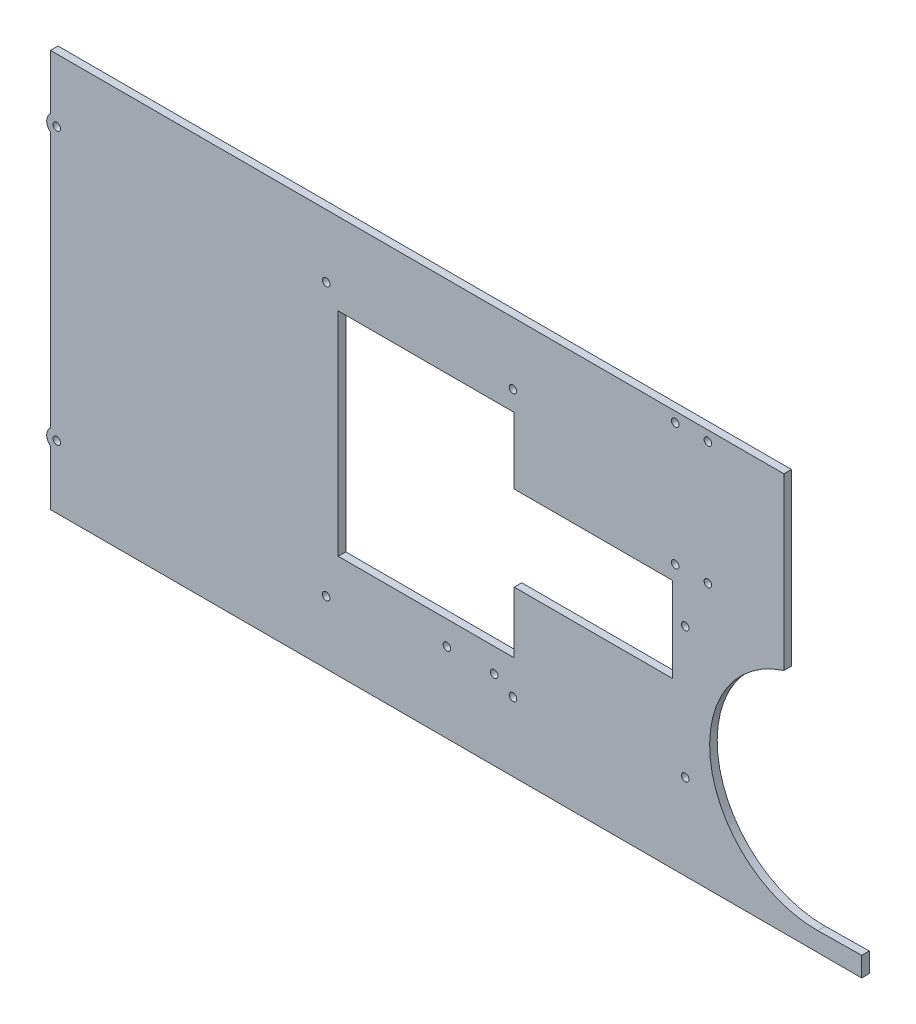
ISO-10303-21;
HEADER;
FILE_DESCRIPTION(('STEP AP214'),'2;1');
FILE_NAME('part.step','',(''),(''),'','','');
FILE_SCHEMA(('AUTOMOTIVE_DESIGN { 1 0 10303 214 1 1 1 1 }'));
ENDSEC;
DATA;
#1=APPLICATION_CONTEXT('core data for automotive mechanical design processes');
#2=APPLICATION_PROTOCOL_DEFINITION('international standard','automotive_design',2000,#1);
#3=PRODUCT_CONTEXT('',#1,'mechanical');
#4=PRODUCT('Part','Part','',(#3));
#5=PRODUCT_RELATED_PRODUCT_CATEGORY('part','',(#4));
#6=PRODUCT_DEFINITION_FORMATION('','',#4);
#7=PRODUCT_DEFINITION_CONTEXT('part definition',#1,'design');
#8=PRODUCT_DEFINITION('design','',#6,#7);
#9=PRODUCT_DEFINITION_SHAPE('','',#8);
#10=(LENGTH_UNIT() NAMED_UNIT(*) SI_UNIT(.MILLI.,.METRE.));
#11=(NAMED_UNIT(*) PLANE_ANGLE_UNIT() SI_UNIT($,.RADIAN.));
#12=(NAMED_UNIT(*) SI_UNIT($,.STERADIAN.) SOLID_ANGLE_UNIT());
#13=UNCERTAINTY_MEASURE_WITH_UNIT(LENGTH_MEASURE(1.E-05),#10,'distance_accuracy_value','');
#14=(GEOMETRIC_REPRESENTATION_CONTEXT(3) GLOBAL_UNCERTAINTY_ASSIGNED_CONTEXT((#13)) GLOBAL_UNIT_ASSIGNED_CONTEXT((#10,
#11,#12)) REPRESENTATION_CONTEXT('',''));
#15=CARTESIAN_POINT('',(0.,0.,0.));
#16=DIRECTION('',(0.,0.,1.));
#17=DIRECTION('',(1.,0.,0.));
#18=AXIS2_PLACEMENT_3D('',#15,#16,#17);
#19=CARTESIAN_POINT('',(-70.4409202424698,27.730742328789,0.));
#20=DIRECTION('',(1.,0.,0.));
#21=DIRECTION('',(0.,1.,0.));
#22=AXIS2_PLACEMENT_3D('',#19,#20,#21);
#23=PLANE('',#22);
#24=DIRECTION('',(0.,-1.,0.));
#25=VECTOR('',#24,1.);
#26=CARTESIAN_POINT('',(-70.4409202424698,27.730742328789,0.));
#27=LINE('',#26,#25);
#28=CARTESIAN_POINT('',(-70.4409202424698,-32.4029546682422,0.));
#29=VERTEX_POINT('',#28);
#30=CARTESIAN_POINT('',(-70.4409202424698,-56.769257671211,0.));
#31=VERTEX_POINT('',#30);
#32=EDGE_CURVE('E364',#29,#31,#27,.T.);
#33=ORIENTED_EDGE('',*,*,#32,.F.);
#34=DIRECTION('',(0.,0.,-1.));
#35=VECTOR('',#34,1.);
#36=CARTESIAN_POINT('',(-70.4409202424698,-32.4029546682422,0.));
#37=LINE('',#36,#35);
#38=CARTESIAN_POINT('',(-70.4409202424698,-32.4029546682422,-3.));
#39=VERTEX_POINT('',#38);
#40=EDGE_CURVE('E40',#29,#39,#37,.T.);
#41=ORIENTED_EDGE('',*,*,#40,.T.);
#42=DIRECTION('',(0.,-1.,0.));
#43=VECTOR('',#42,1.);
#44=CARTESIAN_POINT('',(-70.4409202424698,27.730742328789,-3.));
#45=LINE('',#44,#43);
#46=CARTESIAN_POINT('',(-70.4409202424698,-56.769257671211,-3.));
#47=VERTEX_POINT('',#46);
#48=EDGE_CURVE('E188',#39,#47,#45,.T.);
#49=ORIENTED_EDGE('',*,*,#48,.T.);
#50=DIRECTION('',(0.,0.,-1.));
#51=VECTOR('',#50,1.);
#52=CARTESIAN_POINT('',(-70.4409202424698,-56.769257671211,0.));
#53=LINE('',#52,#51);
#54=EDGE_CURVE('E200',#31,#47,#53,.T.);
#55=ORIENTED_EDGE('',*,*,#54,.F.);
#56=EDGE_LOOP('',(#33,#41,#49,#55));
#57=FACE_BOUND('',#56,.T.);
#58=ADVANCED_FACE('F32',(#57),#23,.F.);
#59=CARTESIAN_POINT('',(-254.85091996247,60.2307423287891,-3.));
#60=DIRECTION('',(1.,0.,0.));
#61=DIRECTION('',(0.,0.,1.));
#62=AXIS2_PLACEMENT_3D('',#59,#60,#61);
#63=PLANE('',#62);
#64=DIRECTION('',(0.,-1.,0.));
#65=VECTOR('',#64,1.);
#66=CARTESIAN_POINT('',(-254.85091996247,60.2307423287891,0.));
#67=LINE('',#66,#65);
#68=CARTESIAN_POINT('',(-254.85091996247,60.2307423287891,0.));
#69=VERTEX_POINT('',#68);
#70=CARTESIAN_POINT('',(-254.85091996247,38.3486734286899,0.));
#71=VERTEX_POINT('',#70);
#72=EDGE_CURVE('E303',#69,#71,#67,.T.);
#73=ORIENTED_EDGE('',*,*,#72,.F.);
#74=DIRECTION('',(0.,0.,1.));
#75=VECTOR('',#74,1.);
#76=CARTESIAN_POINT('',(-254.85091996247,60.2307423287891,-3.));
#77=LINE('',#76,#75);
#78=CARTESIAN_POINT('',(-254.85091996247,60.2307423287891,-3.));
#79=VERTEX_POINT('',#78);
#80=EDGE_CURVE('E302',#79,#69,#77,.T.);
#81=ORIENTED_EDGE('',*,*,#80,.F.);
#82=DIRECTION('',(0.,-1.,0.));
#83=VECTOR('',#82,1.);
#84=CARTESIAN_POINT('',(-254.85091996247,60.2307423287891,-3.));
#85=LINE('',#84,#83);
#86=CARTESIAN_POINT('',(-254.85091996247,38.3486734286899,-3.));
#87=VERTEX_POINT('',#86);
#88=EDGE_CURVE('E283',#79,#87,#85,.T.);
#89=ORIENTED_EDGE('',*,*,#88,.T.);
#90=DIRECTION('',(0.,0.,-1.));
#91=VECTOR('',#90,1.);
#92=CARTESIAN_POINT('',(-254.85091996247,38.3486734286899,0.));
#93=LINE('',#92,#91);
#94=EDGE_CURVE('E213',#71,#87,#93,.T.);
#95=ORIENTED_EDGE('',*,*,#94,.F.);
#96=EDGE_LOOP('',(#73,#81,#89,#95));
#97=FACE_BOUND('',#96,.T.);
#98=ADVANCED_FACE('F441',(#97),#63,.F.);
#99=CARTESIAN_POINT('',(-254.85091996247,32.1036754302943,-3.));
#100=VERTEX_POINT('',#99);
#101=CARTESIAN_POINT('',(-254.85091996247,-69.7967586720138,-3.));
#102=VERTEX_POINT('',#101);
#103=EDGE_CURVE('E287',#100,#102,#85,.T.);
#104=ORIENTED_EDGE('',*,*,#103,.T.);
#105=DIRECTION('',(0.,0.,-1.));
#106=VECTOR('',#105,1.);
#107=CARTESIAN_POINT('',(-254.85091996247,-69.7967586720138,0.));
#108=LINE('',#107,#106);
#109=CARTESIAN_POINT('',(-254.85091996247,-69.7967586720138,0.));
#110=VERTEX_POINT('',#109);
#111=EDGE_CURVE('E223',#110,#102,#108,.T.);
#112=ORIENTED_EDGE('',*,*,#111,.F.);
#113=CARTESIAN_POINT('',(-254.85091996247,32.1036754302943,0.));
#114=VERTEX_POINT('',#113);
#115=EDGE_CURVE('E307',#114,#110,#67,.T.);
#116=ORIENTED_EDGE('',*,*,#115,.F.);
#117=DIRECTION('',(0.,0.,-1.));
#118=VECTOR('',#117,1.);
#119=CARTESIAN_POINT('',(-254.85091996247,32.1036754302943,0.));
#120=LINE('',#119,#118);
#121=EDGE_CURVE('E209',#100,#114,#120,.F.);
#122=ORIENTED_EDGE('',*,*,#121,.F.);
#123=EDGE_LOOP('',(#104,#112,#116,#122));
#124=FACE_BOUND('',#123,.T.);
#125=ADVANCED_FACE('F446',(#124),#63,.F.);
#126=CARTESIAN_POINT('',(-254.85091996247,-76.0417566704094,-3.));
#127=VERTEX_POINT('',#126);
#128=CARTESIAN_POINT('',(-254.85091996247,-97.9238255705086,-3.));
#129=VERTEX_POINT('',#128);
#130=EDGE_CURVE('E288',#127,#129,#85,.T.);
#131=ORIENTED_EDGE('',*,*,#130,.T.);
#132=DIRECTION('',(0.,0.,1.));
#133=VECTOR('',#132,1.);
#134=CARTESIAN_POINT('',(-254.85091996247,-97.9238255705086,-3.));
#135=LINE('',#134,#133);
#136=CARTESIAN_POINT('',(-254.85091996247,-97.9238255705086,0.));
#137=VERTEX_POINT('',#136);
#138=EDGE_CURVE('E170',#129,#137,#135,.T.);
#139=ORIENTED_EDGE('',*,*,#138,.T.);
#140=CARTESIAN_POINT('',(-254.85091996247,-76.0417566704094,0.));
#141=VERTEX_POINT('',#140);
#142=EDGE_CURVE('E280',#141,#137,#67,.T.);
#143=ORIENTED_EDGE('',*,*,#142,.F.);
#144=DIRECTION('',(0.,0.,-1.));
#145=VECTOR('',#144,1.);
#146=CARTESIAN_POINT('',(-254.85091996247,-76.0417566704094,0.));
#147=LINE('',#146,#145);
#148=EDGE_CURVE('E219',#127,#141,#147,.F.);
#149=ORIENTED_EDGE('',*,*,#148,.F.);
#150=EDGE_LOOP('',(#131,#139,#143,#149));
#151=FACE_BOUND('',#150,.T.);
#152=ADVANCED_FACE('F34',(#151),#63,.F.);
#153=CARTESIAN_POINT('',(82.6773280375302,-97.9238255705086,-3.));
#154=DIRECTION('',(0.,1.,0.));
#155=DIRECTION('',(-1.,0.,0.));
#156=AXIS2_PLACEMENT_3D('',#153,#154,#155);
#157=PLANE('',#156);
#158=DIRECTION('',(1.,0.,0.));
#159=VECTOR('',#158,1.);
#160=CARTESIAN_POINT('',(82.6773280375302,-97.9238255705086,0.));
#161=LINE('',#160,#159);
#162=CARTESIAN_POINT('',(67.7284164945036,-97.9238255705086,0.));
#163=VERTEX_POINT('',#162);
#164=EDGE_CURVE('E306',#137,#163,#161,.T.);
#165=ORIENTED_EDGE('',*,*,#164,.F.);
#166=ORIENTED_EDGE('',*,*,#138,.F.);
#167=DIRECTION('',(1.,0.,0.));
#168=VECTOR('',#167,1.);
#169=CARTESIAN_POINT('',(82.6773280375302,-97.9238255705086,-3.));
#170=LINE('',#169,#168);
#171=CARTESIAN_POINT('',(67.7284164945036,-97.9238255705086,-3.));
#172=VERTEX_POINT('',#171);
#173=EDGE_CURVE('E286',#129,#172,#170,.T.);
#174=ORIENTED_EDGE('',*,*,#173,.T.);
#175=DIRECTION('',(0.,0.,-1.));
#176=VECTOR('',#175,1.);
#177=CARTESIAN_POINT('',(67.7284164945036,-97.9238255705086,0.));
#178=LINE('',#177,#176);
#179=EDGE_CURVE('E277',#163,#172,#178,.T.);
#180=ORIENTED_EDGE('',*,*,#179,.F.);
#181=EDGE_LOOP('',(#165,#166,#174,#180));
#182=FACE_BOUND('',#181,.T.);
#183=ADVANCED_FACE('F527',(#182),#157,.F.);
#184=CARTESIAN_POINT('',(50.2241898152786,-90.3422144189195,-3.));
#185=DIRECTION('',(0.0128910209084462,-0.999916907337773,0.));
#186=DIRECTION('',(0.999916907337774,0.0128910209084462,0.));
#187=AXIS2_PLACEMENT_3D('',#184,#185,#186);
#188=PLANE('',#187);
#189=DIRECTION('',(-0.999916907337774,-0.0128910209084462,0.));
#190=VECTOR('',#189,1.);
#191=CARTESIAN_POINT('',(50.2241898152786,-90.3422144189195,-3.));
#192=LINE('',#191,#190);
#193=CARTESIAN_POINT('',(67.7284164945036,-90.1165483156142,-3.));
#194=VERTEX_POINT('',#193);
#195=CARTESIAN_POINT('',(50.2241898152786,-90.3422144189195,-3.));
#196=VERTEX_POINT('',#195);
#197=EDGE_CURVE('E291',#194,#196,#192,.T.);
#198=ORIENTED_EDGE('',*,*,#197,.T.);
#199=DIRECTION('',(0.,0.,1.));
#200=VECTOR('',#199,1.);
#201=CARTESIAN_POINT('',(50.2241898152786,-90.3422144189195,-3.));
#202=LINE('',#201,#200);
#203=CARTESIAN_POINT('',(50.2241898152786,-90.3422144189195,0.));
#204=VERTEX_POINT('',#203);
#205=EDGE_CURVE('E329',#196,#204,#202,.T.);
#206=ORIENTED_EDGE('',*,*,#205,.T.);
#207=DIRECTION('',(-0.999916907337774,-0.0128910209084462,0.));
#208=VECTOR('',#207,1.);
#209=CARTESIAN_POINT('',(50.2241898152786,-90.3422144189195,0.));
#210=LINE('',#209,#208);
#211=CARTESIAN_POINT('',(67.7284164945036,-90.1165483156142,0.));
#212=VERTEX_POINT('',#211);
#213=EDGE_CURVE('E310',#212,#204,#210,.T.);
#214=ORIENTED_EDGE('',*,*,#213,.F.);
#215=DIRECTION('',(0.,0.,-1.));
#216=VECTOR('',#215,1.);
#217=CARTESIAN_POINT('',(67.7284164945036,-90.1165483156142,0.));
#218=LINE('',#217,#216);
#219=EDGE_CURVE('E273',#212,#194,#218,.T.);
#220=ORIENTED_EDGE('',*,*,#219,.T.);
#221=EDGE_LOOP('',(#198,#206,#214,#220));
#222=FACE_BOUND('',#221,.T.);
#223=ADVANCED_FACE('F524',(#222),#188,.F.);
#224=CARTESIAN_POINT('',(49.6773280375301,-47.9238255705086,-3.));
#225=DIRECTION('',(0.,0.,1.));
#226=DIRECTION('',(-1.,0.,0.));
#227=AXIS2_PLACEMENT_3D('',#224,#225,#226);
#228=CYLINDRICAL_SURFACE('',#227,42.4219137981652);
#229=CARTESIAN_POINT('',(49.6773280375301,-47.9238255705086,0.));
#230=DIRECTION('',(0.,0.,-1.));
#231=DIRECTION('',(1.,0.,0.));
#232=AXIS2_PLACEMENT_3D('',#229,#230,#231);
#233=CIRCLE('',#232,42.4219137981652);
#234=CARTESIAN_POINT('',(36.781104637515,-7.50964251163856,0.));
#235=VERTEX_POINT('',#234);
#236=EDGE_CURVE('E313',#204,#235,#233,.T.);
#237=ORIENTED_EDGE('',*,*,#236,.F.);
#238=ORIENTED_EDGE('',*,*,#205,.F.);
#239=CARTESIAN_POINT('',(49.6773280375301,-47.9238255705086,-3.));
#240=DIRECTION('',(0.,0.,-1.));
#241=DIRECTION('',(1.,0.,0.));
#242=AXIS2_PLACEMENT_3D('',#239,#240,#241);
#243=CIRCLE('',#242,42.4219137981652);
#244=CARTESIAN_POINT('',(36.781104637515,-7.50964251163856,-3.));
#245=VERTEX_POINT('',#244);
#246=EDGE_CURVE('E294',#196,#245,#243,.T.);
#247=ORIENTED_EDGE('',*,*,#246,.T.);
#248=DIRECTION('',(0.,0.,1.));
#249=VECTOR('',#248,1.);
#250=CARTESIAN_POINT('',(36.781104637515,-7.50964251163856,-3.));
#251=LINE('',#250,#249);
#252=EDGE_CURVE('E326',#245,#235,#251,.T.);
#253=ORIENTED_EDGE('',*,*,#252,.T.);
#254=EDGE_LOOP('',(#237,#238,#247,#253));
#255=FACE_BOUND('',#254,.T.);
#256=ADVANCED_FACE('F520',(#255),#228,.F.);
#257=CARTESIAN_POINT('',(36.781104637515,60.230742328789,-3.));
#258=DIRECTION('',(-1.,0.,0.));
#259=DIRECTION('',(0.,-1.,0.));
#260=AXIS2_PLACEMENT_3D('',#257,#258,#259);
#261=PLANE('',#260);
#262=DIRECTION('',(0.,1.,0.));
#263=VECTOR('',#262,1.);
#264=CARTESIAN_POINT('',(36.781104637515,60.230742328789,0.));
#265=LINE('',#264,#263);
#266=CARTESIAN_POINT('',(36.781104637515,60.230742328789,0.));
#267=VERTEX_POINT('',#266);
#268=EDGE_CURVE('E316',#235,#267,#265,.T.);
#269=ORIENTED_EDGE('',*,*,#268,.F.);
#270=ORIENTED_EDGE('',*,*,#252,.F.);
#271=DIRECTION('',(0.,1.,0.));
#272=VECTOR('',#271,1.);
#273=CARTESIAN_POINT('',(36.781104637515,60.230742328789,-3.));
#274=LINE('',#273,#272);
#275=CARTESIAN_POINT('',(36.781104637515,60.230742328789,-3.));
#276=VERTEX_POINT('',#275);
#277=EDGE_CURVE('E297',#245,#276,#274,.T.);
#278=ORIENTED_EDGE('',*,*,#277,.T.);
#279=DIRECTION('',(0.,0.,1.));
#280=VECTOR('',#279,1.);
#281=CARTESIAN_POINT('',(36.781104637515,60.230742328789,-3.));
#282=LINE('',#281,#280);
#283=EDGE_CURVE('E323',#276,#267,#282,.T.);
#284=ORIENTED_EDGE('',*,*,#283,.T.);
#285=EDGE_LOOP('',(#269,#270,#278,#284));
#286=FACE_BOUND('',#285,.T.);
#287=ADVANCED_FACE('F512',(#286),#261,.F.);
#288=CARTESIAN_POINT('',(-254.85091996247,60.2307423287891,-3.));
#289=DIRECTION('',(0.,-1.,0.));
#290=DIRECTION('',(1.,0.,0.));
#291=AXIS2_PLACEMENT_3D('',#288,#289,#290);
#292=PLANE('',#291);
#293=DIRECTION('',(-1.,0.,0.));
#294=VECTOR('',#293,1.);
#295=CARTESIAN_POINT('',(-254.85091996247,60.2307423287891,0.));
#296=LINE('',#295,#294);
#297=EDGE_CURVE('E319',#267,#69,#296,.T.);
#298=ORIENTED_EDGE('',*,*,#297,.F.);
#299=ORIENTED_EDGE('',*,*,#283,.F.);
#300=DIRECTION('',(-1.,0.,0.));
#301=VECTOR('',#300,1.);
#302=CARTESIAN_POINT('',(-254.85091996247,60.2307423287891,-3.));
#303=LINE('',#302,#301);
#304=EDGE_CURVE('E300',#276,#79,#303,.T.);
#305=ORIENTED_EDGE('',*,*,#304,.T.);
#306=ORIENTED_EDGE('',*,*,#80,.T.);
#307=EDGE_LOOP('',(#298,#299,#305,#306));
#308=FACE_BOUND('',#307,.T.);
#309=ADVANCED_FACE('F506',(#308),#292,.F.);
#310=CARTESIAN_POINT('',(49.6773280375301,-47.9238255705086,-3.));
#311=DIRECTION('',(0.,0.,-1.));
#312=DIRECTION('',(1.,0.,0.));
#313=AXIS2_PLACEMENT_3D('',#310,#311,#312);
#314=PLANE('',#313);
#315=CARTESIAN_POINT('',(-97.2309202391104,-66.2692576712097,-3.));
#316=DIRECTION('',(0.,0.,-1.));
#317=DIRECTION('',(-1.,0.,0.));
#318=AXIS2_PLACEMENT_3D('',#315,#316,#317);
#319=CIRCLE('',#318,1.5);
#320=CARTESIAN_POINT('',(-98.7309202391104,-66.2692576712097,-3.));
#321=VERTEX_POINT('',#320);
#322=EDGE_CURVE('E181',#321,#321,#319,.T.);
#323=ORIENTED_EDGE('',*,*,#322,.F.);
#324=EDGE_LOOP('',(#323));
#325=FACE_BOUND('',#324,.T.);
#326=CARTESIAN_POINT('',(-78.439915932485,-66.2692576712097,-3.));
#327=DIRECTION('',(0.,0.,-1.));
#328=DIRECTION('',(-1.,0.,0.));
#329=AXIS2_PLACEMENT_3D('',#326,#327,#328);
#330=CIRCLE('',#329,1.5);
#331=CARTESIAN_POINT('',(-79.939915932485,-66.2692576712097,-3.));
#332=VERTEX_POINT('',#331);
#333=EDGE_CURVE('E487',#332,#332,#330,.T.);
#334=ORIENTED_EDGE('',*,*,#333,.F.);
#335=EDGE_LOOP('',(#334));
#336=FACE_BOUND('',#335,.T.);
#337=DIRECTION('',(-1.,0.,0.));
#338=VECTOR('',#337,1.);
#339=CARTESIAN_POINT('',(-7.44092024246983,-32.4029546682422,-3.));
#340=LINE('',#339,#338);
#341=CARTESIAN_POINT('',(-7.44092024246983,-32.4029546682422,-3.));
#342=VERTEX_POINT('',#341);
#343=EDGE_CURVE('E368',#342,#39,#340,.T.);
#344=ORIENTED_EDGE('',*,*,#343,.F.);
#345=DIRECTION('',(0.,-1.,0.));
#346=VECTOR('',#345,1.);
#347=CARTESIAN_POINT('',(-7.44092024246983,1.36262371998924,-3.));
#348=LINE('',#347,#346);
#349=CARTESIAN_POINT('',(-7.44092024246983,1.36262371998924,-3.));
#350=VERTEX_POINT('',#349);
#351=EDGE_CURVE('E180',#350,#342,#348,.T.);
#352=ORIENTED_EDGE('',*,*,#351,.F.);
#353=DIRECTION('',(1.,0.,0.));
#354=VECTOR('',#353,1.);
#355=CARTESIAN_POINT('',(-70.4409202424698,1.36262371998925,-3.));
#356=LINE('',#355,#354);
#357=CARTESIAN_POINT('',(-70.4409202424698,1.36262371998925,-3.));
#358=VERTEX_POINT('',#357);
#359=EDGE_CURVE('E165',#358,#350,#356,.T.);
#360=ORIENTED_EDGE('',*,*,#359,.F.);
#361=CARTESIAN_POINT('',(-70.4409202424698,27.730742328789,-3.));
#362=VERTEX_POINT('',#361);
#363=EDGE_CURVE('E178',#362,#358,#45,.T.);
#364=ORIENTED_EDGE('',*,*,#363,.F.);
#365=DIRECTION('',(1.,0.,0.));
#366=VECTOR('',#365,1.);
#367=CARTESIAN_POINT('',(-140.44092024247,27.730742328789,-3.));
#368=LINE('',#367,#366);
#369=CARTESIAN_POINT('',(-140.44092024247,27.7307423287891,-3.));
#370=VERTEX_POINT('',#369);
#371=EDGE_CURVE('E193',#370,#362,#368,.T.);
#372=ORIENTED_EDGE('',*,*,#371,.F.);
#373=DIRECTION('',(0.,1.,0.));
#374=VECTOR('',#373,1.);
#375=CARTESIAN_POINT('',(-140.44092024247,27.730742328789,-3.));
#376=LINE('',#375,#374);
#377=CARTESIAN_POINT('',(-140.44092024247,-56.769257671211,-3.));
#378=VERTEX_POINT('',#377);
#379=EDGE_CURVE('E55',#378,#370,#376,.T.);
#380=ORIENTED_EDGE('',*,*,#379,.F.);
#381=DIRECTION('',(-1.,0.,0.));
#382=VECTOR('',#381,1.);
#383=CARTESIAN_POINT('',(-140.44092024247,-56.769257671211,-3.));
#384=LINE('',#383,#382);
#385=EDGE_CURVE('E187',#47,#378,#384,.T.);
#386=ORIENTED_EDGE('',*,*,#385,.F.);
#387=ORIENTED_EDGE('',*,*,#48,.F.);
#388=EDGE_LOOP('',(#344,#352,#360,#364,#372,#380,#386,#387));
#389=FACE_BOUND('',#388,.T.);
#390=ORIENTED_EDGE('',*,*,#88,.F.);
#391=ORIENTED_EDGE('',*,*,#304,.F.);
#392=ORIENTED_EDGE('',*,*,#277,.F.);
#393=ORIENTED_EDGE('',*,*,#246,.F.);
#394=ORIENTED_EDGE('',*,*,#197,.F.);
#395=DIRECTION('',(0.,-1.,0.));
#396=VECTOR('',#395,1.);
#397=CARTESIAN_POINT('',(67.7284164945036,-97.9238255705086,-3.));
#398=LINE('',#397,#396);
#399=EDGE_CURVE('E274',#194,#172,#398,.T.);
#400=ORIENTED_EDGE('',*,*,#399,.T.);
#401=ORIENTED_EDGE('',*,*,#173,.F.);
#402=ORIENTED_EDGE('',*,*,#130,.F.);
#403=CARTESIAN_POINT('',(-252.350919962468,-72.9192576712116,-3.));
#404=DIRECTION('',(0.,0.,1.));
#405=DIRECTION('',(1.,0.,0.));
#406=AXIS2_PLACEMENT_3D('',#403,#404,#405);
#407=CIRCLE('',#406,3.99999999999999);
#408=EDGE_CURVE('E216',#102,#127,#407,.T.);
#409=ORIENTED_EDGE('',*,*,#408,.F.);
#410=ORIENTED_EDGE('',*,*,#103,.F.);
#411=CARTESIAN_POINT('',(-252.350919962468,35.2261744294921,-3.));
#412=DIRECTION('',(0.,0.,1.));
#413=DIRECTION('',(1.,0.,0.));
#414=AXIS2_PLACEMENT_3D('',#411,#412,#413);
#415=CIRCLE('',#414,3.99999999999999);
#416=EDGE_CURVE('E199',#87,#100,#415,.T.);
#417=ORIENTED_EDGE('',*,*,#416,.F.);
#418=EDGE_LOOP('',(#390,#391,#392,#393,#394,#400,#401,#402,#409,#410,#417));
#419=FACE_BOUND('',#418,.T.);
#420=CARTESIAN_POINT('',(-145.230919962485,-72.9238255705085,-3.));
#421=DIRECTION('',(0.,0.,1.));
#422=DIRECTION('',(-1.,0.,0.));
#423=AXIS2_PLACEMENT_3D('',#420,#421,#422);
#424=CIRCLE('',#423,1.5);
#425=CARTESIAN_POINT('',(-146.730919962485,-72.9238255705085,-3.));
#426=VERTEX_POINT('',#425);
#427=EDGE_CURVE('E233',#426,#426,#424,.T.);
#428=ORIENTED_EDGE('',*,*,#427,.T.);
#429=EDGE_LOOP('',(#428));
#430=FACE_BOUND('',#429,.T.);
#431=CARTESIAN_POINT('',(-145.230919962485,35.230742328789,-3.));
#432=DIRECTION('',(0.,0.,1.));
#433=DIRECTION('',(1.,0.,0.));
#434=AXIS2_PLACEMENT_3D('',#431,#432,#433);
#435=CIRCLE('',#434,1.5);
#436=CARTESIAN_POINT('',(-143.730919962485,35.230742328789,-3.));
#437=VERTEX_POINT('',#436);
#438=EDGE_CURVE('E237',#437,#437,#435,.T.);
#439=ORIENTED_EDGE('',*,*,#438,.T.);
#440=EDGE_LOOP('',(#439));
#441=FACE_BOUND('',#440,.T.);
#442=CARTESIAN_POINT('',(-6.43991593951062,56.2307423287891,-3.));
#443=DIRECTION('',(0.,0.,1.));
#444=DIRECTION('',(1.,0.,0.));
#445=AXIS2_PLACEMENT_3D('',#442,#443,#444);
#446=CIRCLE('',#445,1.5);
#447=CARTESIAN_POINT('',(-4.93991593951062,56.2307423287891,-3.));
#448=VERTEX_POINT('',#447);
#449=EDGE_CURVE('E246',#448,#448,#446,.T.);
#450=ORIENTED_EDGE('',*,*,#449,.T.);
#451=EDGE_LOOP('',(#450));
#452=FACE_BOUND('',#451,.T.);
#453=CARTESIAN_POINT('',(6.56008406048935,7.43074232878906,-3.));
#454=DIRECTION('',(0.,0.,1.));
#455=DIRECTION('',(-1.,0.,0.));
#456=AXIS2_PLACEMENT_3D('',#453,#454,#455);
#457=CIRCLE('',#456,1.49999999999998);
#458=CARTESIAN_POINT('',(5.06008406048937,7.43074232878906,-3.));
#459=VERTEX_POINT('',#458);
#460=EDGE_CURVE('E244',#459,#459,#457,.T.);
#461=ORIENTED_EDGE('',*,*,#460,.T.);
#462=EDGE_LOOP('',(#461));
#463=FACE_BOUND('',#462,.T.);
#464=CARTESIAN_POINT('',(-6.43991593951062,7.43074232878906,-3.));
#465=DIRECTION('',(0.,0.,1.));
#466=DIRECTION('',(-1.,0.,0.));
#467=AXIS2_PLACEMENT_3D('',#464,#465,#466);
#468=CIRCLE('',#467,1.5);
#469=CARTESIAN_POINT('',(-7.93991593951062,7.43074232878906,-3.));
#470=VERTEX_POINT('',#469);
#471=EDGE_CURVE('E241',#470,#470,#468,.T.);
#472=ORIENTED_EDGE('',*,*,#471,.T.);
#473=EDGE_LOOP('',(#472));
#474=FACE_BOUND('',#473,.T.);
#475=CARTESIAN_POINT('',(6.56008406048937,56.2307423287891,-3.));
#476=DIRECTION('',(0.,0.,1.));
#477=DIRECTION('',(1.,0.,0.));
#478=AXIS2_PLACEMENT_3D('',#475,#476,#477);
#479=CIRCLE('',#478,1.49999999999998);
#480=CARTESIAN_POINT('',(8.06008406048934,56.2307423287891,-3.));
#481=VERTEX_POINT('',#480);
#482=EDGE_CURVE('E249',#481,#481,#479,.T.);
#483=ORIENTED_EDGE('',*,*,#482,.T.);
#484=EDGE_LOOP('',(#483));
#485=FACE_BOUND('',#484,.T.);
#486=CARTESIAN_POINT('',(-70.942671962485,35.5075380293095,-3.));
#487=DIRECTION('',(0.,0.,1.));
#488=DIRECTION('',(1.,0.,0.));
#489=AXIS2_PLACEMENT_3D('',#486,#487,#488);
#490=CIRCLE('',#489,1.49999999999994);
#491=CARTESIAN_POINT('',(-69.4426719624851,35.5075380293095,-3.));
#492=VERTEX_POINT('',#491);
#493=EDGE_CURVE('E255',#492,#492,#490,.T.);
#494=ORIENTED_EDGE('',*,*,#493,.T.);
#495=EDGE_LOOP('',(#494));
#496=FACE_BOUND('',#495,.T.);
#497=CARTESIAN_POINT('',(-70.942671962485,-70.4924619706905,-3.));
#498=DIRECTION('',(0.,0.,1.));
#499=DIRECTION('',(1.,0.,0.));
#500=AXIS2_PLACEMENT_3D('',#497,#498,#499);
#501=CIRCLE('',#500,1.5);
#502=CARTESIAN_POINT('',(-69.442671962485,-70.4924619706905,-3.));
#503=VERTEX_POINT('',#502);
#504=EDGE_CURVE('E259',#503,#503,#501,.T.);
#505=ORIENTED_EDGE('',*,*,#504,.T.);
#506=EDGE_LOOP('',(#505));
#507=FACE_BOUND('',#506,.T.);
#508=CARTESIAN_POINT('',(-2.44267196248502,-11.9238255705082,-3.));
#509=DIRECTION('',(0.,0.,1.));
#510=DIRECTION('',(1.,0.,0.));
#511=AXIS2_PLACEMENT_3D('',#508,#509,#510);
#512=CIRCLE('',#511,1.49999999999994);
#513=CARTESIAN_POINT('',(-0.942671962485079,-11.9238255705082,-3.));
#514=VERTEX_POINT('',#513);
#515=EDGE_CURVE('E263',#514,#514,#512,.T.);
#516=ORIENTED_EDGE('',*,*,#515,.T.);
#517=EDGE_LOOP('',(#516));
#518=FACE_BOUND('',#517,.T.);
#519=CARTESIAN_POINT('',(-2.44267196248502,-63.9238255705082,-3.));
#520=DIRECTION('',(0.,0.,1.));
#521=DIRECTION('',(1.,0.,0.));
#522=AXIS2_PLACEMENT_3D('',#519,#520,#521);
#523=CIRCLE('',#522,1.5);
#524=CARTESIAN_POINT('',(-0.942671962485014,-63.9238255705082,-3.));
#525=VERTEX_POINT('',#524);
#526=EDGE_CURVE('E267',#525,#525,#523,.T.);
#527=ORIENTED_EDGE('',*,*,#526,.T.);
#528=EDGE_LOOP('',(#527));
#529=FACE_BOUND('',#528,.T.);
#530=CARTESIAN_POINT('',(-252.350919962468,-72.9192576712116,-3.));
#531=DIRECTION('',(0.,0.,1.));
#532=DIRECTION('',(1.,0.,0.));
#533=AXIS2_PLACEMENT_3D('',#530,#531,#532);
#534=CIRCLE('',#533,1.50000000000002);
#535=CARTESIAN_POINT('',(-250.850919962468,-72.9192576712116,-3.));
#536=VERTEX_POINT('',#535);
#537=EDGE_CURVE('E226',#536,#536,#534,.T.);
#538=ORIENTED_EDGE('',*,*,#537,.T.);
#539=EDGE_LOOP('',(#538));
#540=FACE_BOUND('',#539,.T.);
#541=CARTESIAN_POINT('',(-252.350919962468,35.2261744294921,-3.));
#542=DIRECTION('',(0.,0.,1.));
#543=DIRECTION('',(-1.,0.,0.));
#544=AXIS2_PLACEMENT_3D('',#541,#542,#543);
#545=CIRCLE('',#544,1.50000000000002);
#546=CARTESIAN_POINT('',(-253.850919962468,35.2261744294921,-3.));
#547=VERTEX_POINT('',#546);
#548=EDGE_CURVE('E227',#547,#547,#545,.T.);
#549=ORIENTED_EDGE('',*,*,#548,.T.);
#550=EDGE_LOOP('',(#549));
#551=FACE_BOUND('',#550,.T.);
#552=ADVANCED_FACE('F175',(#325,#336,#389,#419,#430,#441,#452,#463,#474,#485,#496,#507,#518,
#529,#540,#551),#314,.T.);
#553=CARTESIAN_POINT('',(49.6773280375301,-47.9238255705086,0.));
#554=DIRECTION('',(0.,0.,-1.));
#555=DIRECTION('',(1.,0.,0.));
#556=AXIS2_PLACEMENT_3D('',#553,#554,#555);
#557=PLANE('',#556);
#558=CARTESIAN_POINT('',(-97.2309202391104,-66.2692576712097,0.));
#559=DIRECTION('',(0.,0.,1.));
#560=DIRECTION('',(1.,0.,0.));
#561=AXIS2_PLACEMENT_3D('',#558,#559,#560);
#562=CIRCLE('',#561,1.5);
#563=CARTESIAN_POINT('',(-95.7309202391104,-66.2692576712097,0.));
#564=VERTEX_POINT('',#563);
#565=EDGE_CURVE('E486',#564,#564,#562,.T.);
#566=ORIENTED_EDGE('',*,*,#565,.F.);
#567=EDGE_LOOP('',(#566));
#568=FACE_BOUND('',#567,.T.);
#569=CARTESIAN_POINT('',(-78.439915932485,-66.2692576712097,0.));
#570=DIRECTION('',(0.,0.,1.));
#571=DIRECTION('',(1.,0.,0.));
#572=AXIS2_PLACEMENT_3D('',#569,#570,#571);
#573=CIRCLE('',#572,1.5);
#574=CARTESIAN_POINT('',(-76.939915932485,-66.2692576712097,0.));
#575=VERTEX_POINT('',#574);
#576=EDGE_CURVE('E488',#575,#575,#573,.T.);
#577=ORIENTED_EDGE('',*,*,#576,.F.);
#578=EDGE_LOOP('',(#577));
#579=FACE_BOUND('',#578,.T.);
#580=DIRECTION('',(0.,-1.,0.));
#581=VECTOR('',#580,1.);
#582=CARTESIAN_POINT('',(-7.44092024246983,-47.9238255705086,0.));
#583=LINE('',#582,#581);
#584=CARTESIAN_POINT('',(-7.44092024246983,1.36262371998924,0.));
#585=VERTEX_POINT('',#584);
#586=CARTESIAN_POINT('',(-7.44092024246983,-32.4029546682422,0.));
#587=VERTEX_POINT('',#586);
#588=EDGE_CURVE('E11',#585,#587,#583,.T.);
#589=ORIENTED_EDGE('',*,*,#588,.T.);
#590=DIRECTION('',(-1.,0.,0.));
#591=VECTOR('',#590,1.);
#592=CARTESIAN_POINT('',(49.6773280375301,-32.4029546682422,0.));
#593=LINE('',#592,#591);
#594=EDGE_CURVE('E380',#587,#29,#593,.T.);
#595=ORIENTED_EDGE('',*,*,#594,.T.);
#596=ORIENTED_EDGE('',*,*,#32,.T.);
#597=DIRECTION('',(-1.,0.,0.));
#598=VECTOR('',#597,1.);
#599=CARTESIAN_POINT('',(-140.44092024247,-56.769257671211,0.));
#600=LINE('',#599,#598);
#601=CARTESIAN_POINT('',(-140.44092024247,-56.769257671211,0.));
#602=VERTEX_POINT('',#601);
#603=EDGE_CURVE('E206',#31,#602,#600,.T.);
#604=ORIENTED_EDGE('',*,*,#603,.T.);
#605=DIRECTION('',(0.,1.,0.));
#606=VECTOR('',#605,1.);
#607=CARTESIAN_POINT('',(-140.44092024247,27.730742328789,0.));
#608=LINE('',#607,#606);
#609=CARTESIAN_POINT('',(-140.44092024247,27.730742328789,0.));
#610=VERTEX_POINT('',#609);
#611=EDGE_CURVE('E191',#602,#610,#608,.T.);
#612=ORIENTED_EDGE('',*,*,#611,.T.);
#613=DIRECTION('',(1.,0.,0.));
#614=VECTOR('',#613,1.);
#615=CARTESIAN_POINT('',(-140.44092024247,27.730742328789,0.));
#616=LINE('',#615,#614);
#617=CARTESIAN_POINT('',(-70.4409202424698,27.7307423287891,0.));
#618=VERTEX_POINT('',#617);
#619=EDGE_CURVE('E386',#610,#618,#616,.T.);
#620=ORIENTED_EDGE('',*,*,#619,.T.);
#621=CARTESIAN_POINT('',(-70.4409202424698,1.36262371998925,0.));
#622=VERTEX_POINT('',#621);
#623=EDGE_CURVE('E376',#618,#622,#27,.T.);
#624=ORIENTED_EDGE('',*,*,#623,.T.);
#625=DIRECTION('',(1.,0.,0.));
#626=VECTOR('',#625,1.);
#627=CARTESIAN_POINT('',(49.6773280375302,1.36262371998923,0.));
#628=LINE('',#627,#626);
#629=EDGE_CURVE('E47',#622,#585,#628,.T.);
#630=ORIENTED_EDGE('',*,*,#629,.T.);
#631=EDGE_LOOP('',(#589,#595,#596,#604,#612,#620,#624,#630));
#632=FACE_BOUND('',#631,.T.);
#633=CARTESIAN_POINT('',(-145.230919962485,-72.9238255705085,0.));
#634=DIRECTION('',(0.,0.,1.));
#635=DIRECTION('',(1.,0.,0.));
#636=AXIS2_PLACEMENT_3D('',#633,#634,#635);
#637=CIRCLE('',#636,1.5);
#638=CARTESIAN_POINT('',(-143.730919962485,-72.9238255705085,0.));
#639=VERTEX_POINT('',#638);
#640=EDGE_CURVE('E245',#639,#639,#637,.T.);
#641=ORIENTED_EDGE('',*,*,#640,.F.);
#642=EDGE_LOOP('',(#641));
#643=FACE_BOUND('',#642,.T.);
#644=CARTESIAN_POINT('',(-145.230919962485,35.230742328789,0.));
#645=DIRECTION('',(0.,0.,1.));
#646=DIRECTION('',(1.,0.,0.));
#647=AXIS2_PLACEMENT_3D('',#644,#645,#646);
#648=CIRCLE('',#647,1.5);
#649=CARTESIAN_POINT('',(-143.730919962485,35.230742328789,0.));
#650=VERTEX_POINT('',#649);
#651=EDGE_CURVE('E236',#650,#650,#648,.T.);
#652=ORIENTED_EDGE('',*,*,#651,.F.);
#653=EDGE_LOOP('',(#652));
#654=FACE_BOUND('',#653,.T.);
#655=CARTESIAN_POINT('',(-6.43991593951062,56.2307423287891,0.));
#656=DIRECTION('',(0.,0.,1.));
#657=DIRECTION('',(1.,0.,0.));
#658=AXIS2_PLACEMENT_3D('',#655,#656,#657);
#659=CIRCLE('',#658,1.5);
#660=CARTESIAN_POINT('',(-4.93991593951062,56.2307423287891,0.));
#661=VERTEX_POINT('',#660);
#662=EDGE_CURVE('E262',#661,#661,#659,.T.);
#663=ORIENTED_EDGE('',*,*,#662,.F.);
#664=EDGE_LOOP('',(#663));
#665=FACE_BOUND('',#664,.T.);
#666=CARTESIAN_POINT('',(6.56008406048935,7.43074232878906,0.));
#667=DIRECTION('',(0.,0.,1.));
#668=DIRECTION('',(1.,0.,0.));
#669=AXIS2_PLACEMENT_3D('',#666,#667,#668);
#670=CIRCLE('',#669,1.49999999999998);
#671=CARTESIAN_POINT('',(8.06008406048933,7.43074232878906,0.));
#672=VERTEX_POINT('',#671);
#673=EDGE_CURVE('E347',#672,#672,#670,.T.);
#674=ORIENTED_EDGE('',*,*,#673,.F.);
#675=EDGE_LOOP('',(#674));
#676=FACE_BOUND('',#675,.T.);
#677=CARTESIAN_POINT('',(-6.43991593951062,7.43074232878906,0.));
#678=DIRECTION('',(0.,0.,1.));
#679=DIRECTION('',(1.,0.,0.));
#680=AXIS2_PLACEMENT_3D('',#677,#678,#679);
#681=CIRCLE('',#680,1.5);
#682=CARTESIAN_POINT('',(-4.93991593951062,7.43074232878906,0.));
#683=VERTEX_POINT('',#682);
#684=EDGE_CURVE('E344',#683,#683,#681,.T.);
#685=ORIENTED_EDGE('',*,*,#684,.F.);
#686=EDGE_LOOP('',(#685));
#687=FACE_BOUND('',#686,.T.);
#688=CARTESIAN_POINT('',(6.56008406048937,56.2307423287891,0.));
#689=DIRECTION('',(0.,0.,1.));
#690=DIRECTION('',(1.,0.,0.));
#691=AXIS2_PLACEMENT_3D('',#688,#689,#690);
#692=CIRCLE('',#691,1.49999999999998);
#693=CARTESIAN_POINT('',(8.06008406048934,56.2307423287891,0.));
#694=VERTEX_POINT('',#693);
#695=EDGE_CURVE('E254',#694,#694,#692,.T.);
#696=ORIENTED_EDGE('',*,*,#695,.F.);
#697=EDGE_LOOP('',(#696));
#698=FACE_BOUND('',#697,.T.);
#699=CARTESIAN_POINT('',(-70.942671962485,35.5075380293095,0.));
#700=DIRECTION('',(0.,0.,1.));
#701=DIRECTION('',(1.,0.,0.));
#702=AXIS2_PLACEMENT_3D('',#699,#700,#701);
#703=CIRCLE('',#702,1.49999999999994);
#704=CARTESIAN_POINT('',(-69.4426719624851,35.5075380293095,0.));
#705=VERTEX_POINT('',#704);
#706=EDGE_CURVE('E270',#705,#705,#703,.T.);
#707=ORIENTED_EDGE('',*,*,#706,.F.);
#708=EDGE_LOOP('',(#707));
#709=FACE_BOUND('',#708,.T.);
#710=CARTESIAN_POINT('',(-70.942671962485,-70.4924619706905,0.));
#711=DIRECTION('',(0.,0.,1.));
#712=DIRECTION('',(1.,0.,0.));
#713=AXIS2_PLACEMENT_3D('',#710,#711,#712);
#714=CIRCLE('',#713,1.5);
#715=CARTESIAN_POINT('',(-69.442671962485,-70.4924619706905,0.));
#716=VERTEX_POINT('',#715);
#717=EDGE_CURVE('E258',#716,#716,#714,.T.);
#718=ORIENTED_EDGE('',*,*,#717,.F.);
#719=EDGE_LOOP('',(#718));
#720=FACE_BOUND('',#719,.T.);
#721=CARTESIAN_POINT('',(-2.44267196248502,-11.9238255705082,0.));
#722=DIRECTION('',(0.,0.,1.));
#723=DIRECTION('',(1.,0.,0.));
#724=AXIS2_PLACEMENT_3D('',#721,#722,#723);
#725=CIRCLE('',#724,1.49999999999994);
#726=CARTESIAN_POINT('',(-0.942671962485079,-11.9238255705082,0.));
#727=VERTEX_POINT('',#726);
#728=EDGE_CURVE('E276',#727,#727,#725,.T.);
#729=ORIENTED_EDGE('',*,*,#728,.F.);
#730=EDGE_LOOP('',(#729));
#731=FACE_BOUND('',#730,.T.);
#732=CARTESIAN_POINT('',(-2.44267196248502,-63.9238255705082,0.));
#733=DIRECTION('',(0.,0.,1.));
#734=DIRECTION('',(1.,0.,0.));
#735=AXIS2_PLACEMENT_3D('',#732,#733,#734);
#736=CIRCLE('',#735,1.5);
#737=CARTESIAN_POINT('',(-0.942671962485014,-63.9238255705082,0.));
#738=VERTEX_POINT('',#737);
#739=EDGE_CURVE('E266',#738,#738,#736,.T.);
#740=ORIENTED_EDGE('',*,*,#739,.F.);
#741=EDGE_LOOP('',(#740));
#742=FACE_BOUND('',#741,.T.);
#743=ORIENTED_EDGE('',*,*,#115,.T.);
#744=CARTESIAN_POINT('',(-252.350919962468,-72.9192576712116,0.));
#745=DIRECTION('',(0.,0.,1.));
#746=DIRECTION('',(1.,0.,0.));
#747=AXIS2_PLACEMENT_3D('',#744,#745,#746);
#748=CIRCLE('',#747,3.99999999999999);
#749=EDGE_CURVE('E217',#110,#141,#748,.T.);
#750=ORIENTED_EDGE('',*,*,#749,.T.);
#751=ORIENTED_EDGE('',*,*,#142,.T.);
#752=ORIENTED_EDGE('',*,*,#164,.T.);
#753=DIRECTION('',(0.,-1.,0.));
#754=VECTOR('',#753,1.);
#755=CARTESIAN_POINT('',(67.7284164945036,-97.9238255705086,0.));
#756=LINE('',#755,#754);
#757=EDGE_CURVE('E271',#212,#163,#756,.T.);
#758=ORIENTED_EDGE('',*,*,#757,.F.);
#759=ORIENTED_EDGE('',*,*,#213,.T.);
#760=ORIENTED_EDGE('',*,*,#236,.T.);
#761=ORIENTED_EDGE('',*,*,#268,.T.);
#762=ORIENTED_EDGE('',*,*,#297,.T.);
#763=ORIENTED_EDGE('',*,*,#72,.T.);
#764=CARTESIAN_POINT('',(-252.350919962468,35.2261744294921,0.));
#765=DIRECTION('',(0.,0.,1.));
#766=DIRECTION('',(1.,0.,0.));
#767=AXIS2_PLACEMENT_3D('',#764,#765,#766);
#768=CIRCLE('',#767,3.99999999999999);
#769=EDGE_CURVE('E207',#71,#114,#768,.T.);
#770=ORIENTED_EDGE('',*,*,#769,.T.);
#771=EDGE_LOOP('',(#743,#750,#751,#752,#758,#759,#760,#761,#762,#763,#770));
#772=FACE_BOUND('',#771,.T.);
#773=CARTESIAN_POINT('',(-252.350919962468,-72.9192576712116,0.));
#774=DIRECTION('',(0.,0.,1.));
#775=DIRECTION('',(1.,0.,0.));
#776=AXIS2_PLACEMENT_3D('',#773,#774,#775);
#777=CIRCLE('',#776,1.50000000000002);
#778=CARTESIAN_POINT('',(-250.850919962468,-72.9192576712116,0.));
#779=VERTEX_POINT('',#778);
#780=EDGE_CURVE('E230',#779,#779,#777,.T.);
#781=ORIENTED_EDGE('',*,*,#780,.F.);
#782=EDGE_LOOP('',(#781));
#783=FACE_BOUND('',#782,.T.);
#784=CARTESIAN_POINT('',(-252.350919962468,35.2261744294921,0.));
#785=DIRECTION('',(0.,0.,1.));
#786=DIRECTION('',(1.,0.,0.));
#787=AXIS2_PLACEMENT_3D('',#784,#785,#786);
#788=CIRCLE('',#787,1.50000000000002);
#789=CARTESIAN_POINT('',(-250.850919962468,35.2261744294921,0.));
#790=VERTEX_POINT('',#789);
#791=EDGE_CURVE('E240',#790,#790,#788,.T.);
#792=ORIENTED_EDGE('',*,*,#791,.F.);
#793=EDGE_LOOP('',(#792));
#794=FACE_BOUND('',#793,.T.);
#795=ADVANCED_FACE('F389',(#568,#579,#632,#643,#654,#665,#676,#687,#698,#709,#720,#731,#742,
#772,#783,#794),#557,.F.);
#796=CARTESIAN_POINT('',(67.7284164945036,-97.9238255705086,0.));
#797=DIRECTION('',(-1.,0.,0.));
#798=DIRECTION('',(0.,0.,-1.));
#799=AXIS2_PLACEMENT_3D('',#796,#797,#798);
#800=PLANE('',#799);
#801=ORIENTED_EDGE('',*,*,#399,.F.);
#802=ORIENTED_EDGE('',*,*,#219,.F.);
#803=ORIENTED_EDGE('',*,*,#757,.T.);
#804=ORIENTED_EDGE('',*,*,#179,.T.);
#805=EDGE_LOOP('',(#801,#802,#803,#804));
#806=FACE_BOUND('',#805,.T.);
#807=ADVANCED_FACE('F392',(#806),#800,.F.);
#808=CARTESIAN_POINT('',(-2.44267196248502,-63.9238255705082,1.));
#809=DIRECTION('',(0.,0.,-1.));
#810=DIRECTION('',(1.,0.,0.));
#811=AXIS2_PLACEMENT_3D('',#808,#809,#810);
#812=CYLINDRICAL_SURFACE('',#811,1.5);
#813=ORIENTED_EDGE('',*,*,#526,.F.);
#814=EDGE_LOOP('',(#813));
#815=FACE_BOUND('',#814,.T.);
#816=ORIENTED_EDGE('',*,*,#739,.T.);
#817=EDGE_LOOP('',(#816));
#818=FACE_BOUND('',#817,.T.);
#819=ADVANCED_FACE('F560',(#815,#818),#812,.F.);
#820=CARTESIAN_POINT('',(-2.44267196248502,-11.9238255705082,1.));
#821=DIRECTION('',(0.,0.,-1.));
#822=DIRECTION('',(1.,0.,0.));
#823=AXIS2_PLACEMENT_3D('',#820,#821,#822);
#824=CYLINDRICAL_SURFACE('',#823,1.49999999999994);
#825=ORIENTED_EDGE('',*,*,#515,.F.);
#826=EDGE_LOOP('',(#825));
#827=FACE_BOUND('',#826,.T.);
#828=ORIENTED_EDGE('',*,*,#728,.T.);
#829=EDGE_LOOP('',(#828));
#830=FACE_BOUND('',#829,.T.);
#831=ADVANCED_FACE('F564',(#827,#830),#824,.F.);
#832=CARTESIAN_POINT('',(-70.942671962485,-70.4924619706905,1.));
#833=DIRECTION('',(0.,0.,-1.));
#834=DIRECTION('',(1.,0.,0.));
#835=AXIS2_PLACEMENT_3D('',#832,#833,#834);
#836=CYLINDRICAL_SURFACE('',#835,1.5);
#837=ORIENTED_EDGE('',*,*,#504,.F.);
#838=EDGE_LOOP('',(#837));
#839=FACE_BOUND('',#838,.T.);
#840=ORIENTED_EDGE('',*,*,#717,.T.);
#841=EDGE_LOOP('',(#840));
#842=FACE_BOUND('',#841,.T.);
#843=ADVANCED_FACE('F569',(#839,#842),#836,.F.);
#844=CARTESIAN_POINT('',(-70.942671962485,35.5075380293095,1.));
#845=DIRECTION('',(0.,0.,-1.));
#846=DIRECTION('',(1.,0.,0.));
#847=AXIS2_PLACEMENT_3D('',#844,#845,#846);
#848=CYLINDRICAL_SURFACE('',#847,1.49999999999994);
#849=ORIENTED_EDGE('',*,*,#493,.F.);
#850=EDGE_LOOP('',(#849));
#851=FACE_BOUND('',#850,.T.);
#852=ORIENTED_EDGE('',*,*,#706,.T.);
#853=EDGE_LOOP('',(#852));
#854=FACE_BOUND('',#853,.T.);
#855=ADVANCED_FACE('F577',(#851,#854),#848,.F.);
#856=CARTESIAN_POINT('',(6.56008406048937,56.2307423287891,7.));
#857=DIRECTION('',(0.,0.,-1.));
#858=DIRECTION('',(1.,0.,0.));
#859=AXIS2_PLACEMENT_3D('',#856,#857,#858);
#860=CYLINDRICAL_SURFACE('',#859,1.49999999999998);
#861=ORIENTED_EDGE('',*,*,#482,.F.);
#862=EDGE_LOOP('',(#861));
#863=FACE_BOUND('',#862,.T.);
#864=ORIENTED_EDGE('',*,*,#695,.T.);
#865=EDGE_LOOP('',(#864));
#866=FACE_BOUND('',#865,.T.);
#867=ADVANCED_FACE('F581',(#863,#866),#860,.F.);
#868=CARTESIAN_POINT('',(-6.43991593951062,7.43074232878906,7.));
#869=DIRECTION('',(0.,0.,-1.));
#870=DIRECTION('',(1.,0.,0.));
#871=AXIS2_PLACEMENT_3D('',#868,#869,#870);
#872=CYLINDRICAL_SURFACE('',#871,1.5);
#873=ORIENTED_EDGE('',*,*,#471,.F.);
#874=EDGE_LOOP('',(#873));
#875=FACE_BOUND('',#874,.T.);
#876=ORIENTED_EDGE('',*,*,#684,.T.);
#877=EDGE_LOOP('',(#876));
#878=FACE_BOUND('',#877,.T.);
#879=ADVANCED_FACE('F585',(#875,#878),#872,.F.);
#880=CARTESIAN_POINT('',(6.56008406048935,7.43074232878906,7.));
#881=DIRECTION('',(0.,0.,-1.));
#882=DIRECTION('',(1.,0.,0.));
#883=AXIS2_PLACEMENT_3D('',#880,#881,#882);
#884=CYLINDRICAL_SURFACE('',#883,1.49999999999998);
#885=ORIENTED_EDGE('',*,*,#460,.F.);
#886=EDGE_LOOP('',(#885));
#887=FACE_BOUND('',#886,.T.);
#888=ORIENTED_EDGE('',*,*,#673,.T.);
#889=EDGE_LOOP('',(#888));
#890=FACE_BOUND('',#889,.T.);
#891=ADVANCED_FACE('F587',(#887,#890),#884,.F.);
#892=CARTESIAN_POINT('',(-6.43991593951062,56.2307423287891,7.));
#893=DIRECTION('',(0.,0.,-1.));
#894=DIRECTION('',(1.,0.,0.));
#895=AXIS2_PLACEMENT_3D('',#892,#893,#894);
#896=CYLINDRICAL_SURFACE('',#895,1.5);
#897=ORIENTED_EDGE('',*,*,#449,.F.);
#898=EDGE_LOOP('',(#897));
#899=FACE_BOUND('',#898,.T.);
#900=ORIENTED_EDGE('',*,*,#662,.T.);
#901=EDGE_LOOP('',(#900));
#902=FACE_BOUND('',#901,.T.);
#903=ADVANCED_FACE('F590',(#899,#902),#896,.F.);
#904=CARTESIAN_POINT('',(-145.230919962485,35.230742328789,7.));
#905=DIRECTION('',(0.,0.,-1.));
#906=DIRECTION('',(1.,0.,0.));
#907=AXIS2_PLACEMENT_3D('',#904,#905,#906);
#908=CYLINDRICAL_SURFACE('',#907,1.5);
#909=ORIENTED_EDGE('',*,*,#438,.F.);
#910=EDGE_LOOP('',(#909));
#911=FACE_BOUND('',#910,.T.);
#912=ORIENTED_EDGE('',*,*,#651,.T.);
#913=EDGE_LOOP('',(#912));
#914=FACE_BOUND('',#913,.T.);
#915=ADVANCED_FACE('F594',(#911,#914),#908,.F.);
#916=CARTESIAN_POINT('',(-145.230919962485,-72.9238255705085,7.));
#917=DIRECTION('',(0.,0.,-1.));
#918=DIRECTION('',(1.,0.,0.));
#919=AXIS2_PLACEMENT_3D('',#916,#917,#918);
#920=CYLINDRICAL_SURFACE('',#919,1.5);
#921=ORIENTED_EDGE('',*,*,#427,.F.);
#922=EDGE_LOOP('',(#921));
#923=FACE_BOUND('',#922,.T.);
#924=ORIENTED_EDGE('',*,*,#640,.T.);
#925=EDGE_LOOP('',(#924));
#926=FACE_BOUND('',#925,.T.);
#927=ADVANCED_FACE('F436',(#923,#926),#920,.F.);
#928=CARTESIAN_POINT('',(-252.350919962468,-72.9192576712116,7.));
#929=DIRECTION('',(0.,0.,-1.));
#930=DIRECTION('',(1.,0.,0.));
#931=AXIS2_PLACEMENT_3D('',#928,#929,#930);
#932=CYLINDRICAL_SURFACE('',#931,1.50000000000002);
#933=ORIENTED_EDGE('',*,*,#537,.F.);
#934=EDGE_LOOP('',(#933));
#935=FACE_BOUND('',#934,.T.);
#936=ORIENTED_EDGE('',*,*,#780,.T.);
#937=EDGE_LOOP('',(#936));
#938=FACE_BOUND('',#937,.T.);
#939=ADVANCED_FACE('F426',(#935,#938),#932,.F.);
#940=CARTESIAN_POINT('',(-252.350919962468,35.2261744294921,7.));
#941=DIRECTION('',(0.,0.,-1.));
#942=DIRECTION('',(1.,0.,0.));
#943=AXIS2_PLACEMENT_3D('',#940,#941,#942);
#944=CYLINDRICAL_SURFACE('',#943,1.50000000000002);
#945=ORIENTED_EDGE('',*,*,#548,.F.);
#946=EDGE_LOOP('',(#945));
#947=FACE_BOUND('',#946,.T.);
#948=ORIENTED_EDGE('',*,*,#791,.T.);
#949=EDGE_LOOP('',(#948));
#950=FACE_BOUND('',#949,.T.);
#951=ADVANCED_FACE('F423',(#947,#950),#944,.F.);
#952=CARTESIAN_POINT('',(-252.350919962468,-72.9192576712116,0.));
#953=DIRECTION('',(0.,0.,-1.));
#954=DIRECTION('',(1.,0.,0.));
#955=AXIS2_PLACEMENT_3D('',#952,#953,#954);
#956=CYLINDRICAL_SURFACE('',#955,3.99999999999999);
#957=ORIENTED_EDGE('',*,*,#111,.T.);
#958=ORIENTED_EDGE('',*,*,#408,.T.);
#959=ORIENTED_EDGE('',*,*,#148,.T.);
#960=ORIENTED_EDGE('',*,*,#749,.F.);
#961=EDGE_LOOP('',(#957,#958,#959,#960));
#962=FACE_BOUND('',#961,.T.);
#963=ADVANCED_FACE('F425',(#962),#956,.T.);
#964=CARTESIAN_POINT('',(-252.350919962468,35.2261744294921,0.));
#965=DIRECTION('',(0.,0.,-1.));
#966=DIRECTION('',(1.,0.,0.));
#967=AXIS2_PLACEMENT_3D('',#964,#965,#966);
#968=CYLINDRICAL_SURFACE('',#967,3.99999999999999);
#969=ORIENTED_EDGE('',*,*,#94,.T.);
#970=ORIENTED_EDGE('',*,*,#416,.T.);
#971=ORIENTED_EDGE('',*,*,#121,.T.);
#972=ORIENTED_EDGE('',*,*,#769,.F.);
#973=EDGE_LOOP('',(#969,#970,#971,#972));
#974=FACE_BOUND('',#973,.T.);
#975=ADVANCED_FACE('F433',(#974),#968,.T.);
#976=CARTESIAN_POINT('',(-140.44092024247,27.730742328789,0.));
#977=DIRECTION('',(-1.,0.,0.));
#978=DIRECTION('',(0.,0.,1.));
#979=AXIS2_PLACEMENT_3D('',#976,#977,#978);
#980=PLANE('',#979);
#981=ORIENTED_EDGE('',*,*,#379,.T.);
#982=DIRECTION('',(0.,0.,-1.));
#983=VECTOR('',#982,1.);
#984=CARTESIAN_POINT('',(-140.44092024247,27.730742328789,0.));
#985=LINE('',#984,#983);
#986=EDGE_CURVE('E204',#610,#370,#985,.T.);
#987=ORIENTED_EDGE('',*,*,#986,.F.);
#988=ORIENTED_EDGE('',*,*,#611,.F.);
#989=DIRECTION('',(0.,0.,-1.));
#990=VECTOR('',#989,1.);
#991=CARTESIAN_POINT('',(-140.44092024247,-56.769257671211,0.));
#992=LINE('',#991,#990);
#993=EDGE_CURVE('E197',#602,#378,#992,.T.);
#994=ORIENTED_EDGE('',*,*,#993,.T.);
#995=EDGE_LOOP('',(#981,#987,#988,#994));
#996=FACE_BOUND('',#995,.T.);
#997=ADVANCED_FACE('F458',(#996),#980,.F.);
#998=CARTESIAN_POINT('',(-140.44092024247,-56.769257671211,0.));
#999=DIRECTION('',(0.,-1.,0.));
#1000=DIRECTION('',(1.,0.,0.));
#1001=AXIS2_PLACEMENT_3D('',#998,#999,#1000);
#1002=PLANE('',#1001);
#1003=ORIENTED_EDGE('',*,*,#385,.T.);
#1004=ORIENTED_EDGE('',*,*,#993,.F.);
#1005=ORIENTED_EDGE('',*,*,#603,.F.);
#1006=ORIENTED_EDGE('',*,*,#54,.T.);
#1007=EDGE_LOOP('',(#1003,#1004,#1005,#1006));
#1008=FACE_BOUND('',#1007,.T.);
#1009=ADVANCED_FACE('F370',(#1008),#1002,.F.);
#1010=ORIENTED_EDGE('',*,*,#363,.T.);
#1011=DIRECTION('',(0.,0.,1.));
#1012=VECTOR('',#1011,1.);
#1013=CARTESIAN_POINT('',(-70.4409202424698,1.36262371998925,0.));
#1014=LINE('',#1013,#1012);
#1015=EDGE_CURVE('E162',#358,#622,#1014,.T.);
#1016=ORIENTED_EDGE('',*,*,#1015,.T.);
#1017=ORIENTED_EDGE('',*,*,#623,.F.);
#1018=DIRECTION('',(0.,0.,-1.));
#1019=VECTOR('',#1018,1.);
#1020=CARTESIAN_POINT('',(-70.4409202424698,27.730742328789,0.));
#1021=LINE('',#1020,#1019);
#1022=EDGE_CURVE('E185',#618,#362,#1021,.T.);
#1023=ORIENTED_EDGE('',*,*,#1022,.T.);
#1024=EDGE_LOOP('',(#1010,#1016,#1017,#1023));
#1025=FACE_BOUND('',#1024,.T.);
#1026=ADVANCED_FACE('F183',(#1025),#23,.F.);
#1027=CARTESIAN_POINT('',(-140.44092024247,27.730742328789,0.));
#1028=DIRECTION('',(0.,1.,0.));
#1029=DIRECTION('',(-1.,0.,0.));
#1030=AXIS2_PLACEMENT_3D('',#1027,#1028,#1029);
#1031=PLANE('',#1030);
#1032=ORIENTED_EDGE('',*,*,#371,.T.);
#1033=ORIENTED_EDGE('',*,*,#1022,.F.);
#1034=ORIENTED_EDGE('',*,*,#619,.F.);
#1035=ORIENTED_EDGE('',*,*,#986,.T.);
#1036=EDGE_LOOP('',(#1032,#1033,#1034,#1035));
#1037=FACE_BOUND('',#1036,.T.);
#1038=ADVANCED_FACE('F451',(#1037),#1031,.F.);
#1039=CARTESIAN_POINT('',(-7.44092024246983,1.36262371998924,7.));
#1040=DIRECTION('',(1.,0.,0.));
#1041=DIRECTION('',(0.,1.,0.));
#1042=AXIS2_PLACEMENT_3D('',#1039,#1040,#1041);
#1043=PLANE('',#1042);
#1044=DIRECTION('',(0.,0.,-1.));
#1045=VECTOR('',#1044,1.);
#1046=CARTESIAN_POINT('',(-7.44092024246983,1.36262371998924,7.));
#1047=LINE('',#1046,#1045);
#1048=EDGE_CURVE('E498',#585,#350,#1047,.T.);
#1049=ORIENTED_EDGE('',*,*,#1048,.T.);
#1050=ORIENTED_EDGE('',*,*,#351,.T.);
#1051=DIRECTION('',(0.,0.,-1.));
#1052=VECTOR('',#1051,1.);
#1053=CARTESIAN_POINT('',(-7.44092024246983,-32.4029546682422,7.));
#1054=LINE('',#1053,#1052);
#1055=EDGE_CURVE('E382',#587,#342,#1054,.T.);
#1056=ORIENTED_EDGE('',*,*,#1055,.F.);
#1057=ORIENTED_EDGE('',*,*,#588,.F.);
#1058=EDGE_LOOP('',(#1049,#1050,#1056,#1057));
#1059=FACE_BOUND('',#1058,.T.);
#1060=ADVANCED_FACE('F456',(#1059),#1043,.F.);
#1061=CARTESIAN_POINT('',(-7.44092024246983,-32.4029546682422,7.));
#1062=DIRECTION('',(0.,-1.,0.));
#1063=DIRECTION('',(0.,0.,-1.));
#1064=AXIS2_PLACEMENT_3D('',#1061,#1062,#1063);
#1065=PLANE('',#1064);
#1066=ORIENTED_EDGE('',*,*,#1055,.T.);
#1067=ORIENTED_EDGE('',*,*,#343,.T.);
#1068=ORIENTED_EDGE('',*,*,#40,.F.);
#1069=ORIENTED_EDGE('',*,*,#594,.F.);
#1070=EDGE_LOOP('',(#1066,#1067,#1068,#1069));
#1071=FACE_BOUND('',#1070,.T.);
#1072=ADVANCED_FACE('F467',(#1071),#1065,.F.);
#1073=CARTESIAN_POINT('',(-70.4409202424698,1.36262371998925,7.));
#1074=DIRECTION('',(0.,1.,0.));
#1075=DIRECTION('',(-1.,0.,0.));
#1076=AXIS2_PLACEMENT_3D('',#1073,#1074,#1075);
#1077=PLANE('',#1076);
#1078=ORIENTED_EDGE('',*,*,#1015,.F.);
#1079=ORIENTED_EDGE('',*,*,#359,.T.);
#1080=ORIENTED_EDGE('',*,*,#1048,.F.);
#1081=ORIENTED_EDGE('',*,*,#629,.F.);
#1082=EDGE_LOOP('',(#1078,#1079,#1080,#1081));
#1083=FACE_BOUND('',#1082,.T.);
#1084=ADVANCED_FACE('F164',(#1083),#1077,.F.);
#1085=CARTESIAN_POINT('',(-78.439915932485,-66.2692576712097,-10.));
#1086=DIRECTION('',(0.,0.,1.));
#1087=DIRECTION('',(1.,0.,0.));
#1088=AXIS2_PLACEMENT_3D('',#1085,#1086,#1087);
#1089=CYLINDRICAL_SURFACE('',#1088,1.5);
#1090=ORIENTED_EDGE('',*,*,#333,.T.);
#1091=EDGE_LOOP('',(#1090));
#1092=FACE_BOUND('',#1091,.T.);
#1093=ORIENTED_EDGE('',*,*,#576,.T.);
#1094=EDGE_LOOP('',(#1093));
#1095=FACE_BOUND('',#1094,.T.);
#1096=ADVANCED_FACE('F466',(#1092,#1095),#1089,.F.);
#1097=CARTESIAN_POINT('',(-97.2309202391104,-66.2692576712097,-10.));
#1098=DIRECTION('',(0.,0.,1.));
#1099=DIRECTION('',(1.,0.,0.));
#1100=AXIS2_PLACEMENT_3D('',#1097,#1098,#1099);
#1101=CYLINDRICAL_SURFACE('',#1100,1.5);
#1102=ORIENTED_EDGE('',*,*,#322,.T.);
#1103=EDGE_LOOP('',(#1102));
#1104=FACE_BOUND('',#1103,.T.);
#1105=ORIENTED_EDGE('',*,*,#565,.T.);
#1106=EDGE_LOOP('',(#1105));
#1107=FACE_BOUND('',#1106,.T.);
#1108=ADVANCED_FACE('F475',(#1104,#1107),#1101,.F.);
#1109=CLOSED_SHELL('',(#58,#98,#125,#152,#183,#223,#256,#287,#309,#552,#795,#807,#819,#831,#843,
#855,#867,#879,#891,#903,#915,#927,#939,#951,#963,#975,#997,#1009,#1026,#1038,#1060,#1072,#1084,
#1096,#1108));
#1110=MANIFOLD_SOLID_BREP('B2',#1109);
#1111=ADVANCED_BREP_SHAPE_REPRESENTATION('',(#18,#1110),#14);
#1112=SHAPE_DEFINITION_REPRESENTATION(#9,#1111);
ENDSEC;
END-ISO-10303-21;
